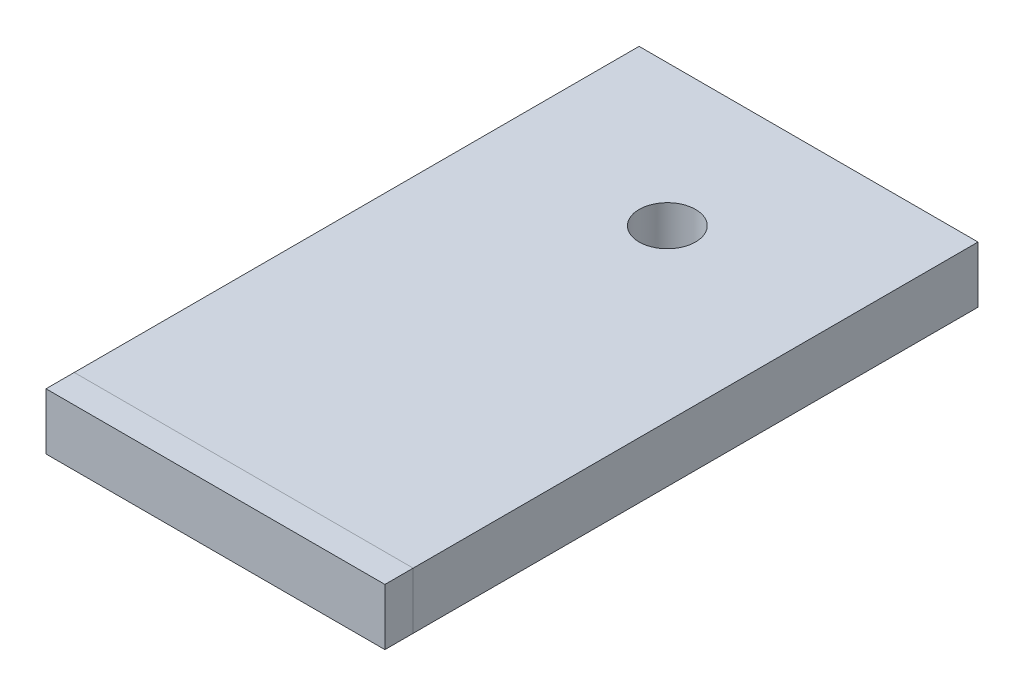
ISO-10303-21;
HEADER;
FILE_DESCRIPTION(('STEP AP214'),'2;1');
FILE_NAME('part.step','',(''),(''),'','','');
FILE_SCHEMA(('AUTOMOTIVE_DESIGN { 1 0 10303 214 1 1 1 1 }'));
ENDSEC;
DATA;
#1=APPLICATION_CONTEXT('core data for automotive mechanical design processes');
#2=APPLICATION_PROTOCOL_DEFINITION('international standard','automotive_design',2000,#1);
#3=PRODUCT_CONTEXT('',#1,'mechanical');
#4=PRODUCT('Part','Part','',(#3));
#5=PRODUCT_RELATED_PRODUCT_CATEGORY('part','',(#4));
#6=PRODUCT_DEFINITION_FORMATION('','',#4);
#7=PRODUCT_DEFINITION_CONTEXT('part definition',#1,'design');
#8=PRODUCT_DEFINITION('design','',#6,#7);
#9=PRODUCT_DEFINITION_SHAPE('','',#8);
#10=(LENGTH_UNIT() NAMED_UNIT(*) SI_UNIT(.MILLI.,.METRE.));
#11=(NAMED_UNIT(*) PLANE_ANGLE_UNIT() SI_UNIT($,.RADIAN.));
#12=(NAMED_UNIT(*) SI_UNIT($,.STERADIAN.) SOLID_ANGLE_UNIT());
#13=UNCERTAINTY_MEASURE_WITH_UNIT(LENGTH_MEASURE(1.E-05),#10,'distance_accuracy_value','');
#14=(GEOMETRIC_REPRESENTATION_CONTEXT(3) GLOBAL_UNCERTAINTY_ASSIGNED_CONTEXT((#13)) GLOBAL_UNIT_ASSIGNED_CONTEXT((#10,
#11,#12)) REPRESENTATION_CONTEXT('',''));
#15=CARTESIAN_POINT('',(0.,0.,0.));
#16=DIRECTION('',(0.,0.,1.));
#17=DIRECTION('',(1.,0.,0.));
#18=AXIS2_PLACEMENT_3D('',#15,#16,#17);
#19=CARTESIAN_POINT('',(38.1,19.05,69.85));
#20=DIRECTION('',(-1.,0.,0.));
#21=DIRECTION('',(0.,0.,1.));
#22=AXIS2_PLACEMENT_3D('',#19,#20,#21);
#23=PLANE('',#22);
#24=DIRECTION('',(0.,1.,0.));
#25=VECTOR('',#24,1.);
#26=CARTESIAN_POINT('',(38.1,19.05,69.85));
#27=LINE('',#26,#25);
#28=CARTESIAN_POINT('',(38.1,6.35,69.85));
#29=VERTEX_POINT('',#28);
#30=CARTESIAN_POINT('',(38.1,19.05,69.85));
#31=VERTEX_POINT('',#30);
#32=EDGE_CURVE('E100',#29,#31,#27,.T.);
#33=ORIENTED_EDGE('',*,*,#32,.F.);
#34=DIRECTION('',(0.,0.,-1.));
#35=VECTOR('',#34,1.);
#36=CARTESIAN_POINT('',(38.1,6.35,69.85));
#37=LINE('',#36,#35);
#38=CARTESIAN_POINT('',(38.1,6.35,63.5));
#39=VERTEX_POINT('',#38);
#40=EDGE_CURVE('E105',#29,#39,#37,.T.);
#41=ORIENTED_EDGE('',*,*,#40,.T.);
#42=DIRECTION('',(0.,1.,0.));
#43=VECTOR('',#42,1.);
#44=CARTESIAN_POINT('',(38.1,19.05,63.5));
#45=LINE('',#44,#43);
#46=CARTESIAN_POINT('',(38.1,19.05,63.5));
#47=VERTEX_POINT('',#46);
#48=EDGE_CURVE('E92',#39,#47,#45,.T.);
#49=ORIENTED_EDGE('',*,*,#48,.T.);
#50=DIRECTION('',(0.,0.,-1.));
#51=VECTOR('',#50,1.);
#52=CARTESIAN_POINT('',(38.1,19.05,69.85));
#53=LINE('',#52,#51);
#54=EDGE_CURVE('E54',#31,#47,#53,.T.);
#55=ORIENTED_EDGE('',*,*,#54,.F.);
#56=EDGE_LOOP('',(#33,#41,#49,#55));
#57=FACE_BOUND('',#56,.T.);
#58=ADVANCED_FACE('F47',(#57),#23,.F.);
#59=CARTESIAN_POINT('',(-38.1,19.05,69.85));
#60=DIRECTION('',(0.,-1.,0.));
#61=DIRECTION('',(0.,0.,-1.));
#62=AXIS2_PLACEMENT_3D('',#59,#60,#61);
#63=PLANE('',#62);
#64=DIRECTION('',(-1.,0.,0.));
#65=VECTOR('',#64,1.);
#66=CARTESIAN_POINT('',(-38.1,19.05,63.5));
#67=LINE('',#66,#65);
#68=CARTESIAN_POINT('',(-38.1,19.05,63.5));
#69=VERTEX_POINT('',#68);
#70=EDGE_CURVE('E82',#47,#69,#67,.T.);
#71=ORIENTED_EDGE('',*,*,#70,.T.);
#72=DIRECTION('',(0.,0.,-1.));
#73=VECTOR('',#72,1.);
#74=CARTESIAN_POINT('',(-38.1,19.05,69.85));
#75=LINE('',#74,#73);
#76=CARTESIAN_POINT('',(-38.1,19.05,69.85));
#77=VERTEX_POINT('',#76);
#78=EDGE_CURVE('E85',#77,#69,#75,.T.);
#79=ORIENTED_EDGE('',*,*,#78,.F.);
#80=DIRECTION('',(-1.,0.,0.));
#81=VECTOR('',#80,1.);
#82=CARTESIAN_POINT('',(-38.1,19.05,69.85));
#83=LINE('',#82,#81);
#84=EDGE_CURVE('E69',#31,#77,#83,.T.);
#85=ORIENTED_EDGE('',*,*,#84,.F.);
#86=ORIENTED_EDGE('',*,*,#54,.T.);
#87=EDGE_LOOP('',(#71,#79,#85,#86));
#88=FACE_BOUND('',#87,.T.);
#89=ADVANCED_FACE('F84',(#88),#63,.F.);
#90=CARTESIAN_POINT('',(-38.1,19.05,69.85));
#91=DIRECTION('',(1.,0.,0.));
#92=DIRECTION('',(0.,0.,-1.));
#93=AXIS2_PLACEMENT_3D('',#90,#91,#92);
#94=PLANE('',#93);
#95=DIRECTION('',(0.,-1.,0.));
#96=VECTOR('',#95,1.);
#97=CARTESIAN_POINT('',(-38.1,19.05,63.5));
#98=LINE('',#97,#96);
#99=CARTESIAN_POINT('',(-38.1,6.35,63.5));
#100=VERTEX_POINT('',#99);
#101=EDGE_CURVE('E91',#69,#100,#98,.T.);
#102=ORIENTED_EDGE('',*,*,#101,.T.);
#103=DIRECTION('',(0.,0.,-1.));
#104=VECTOR('',#103,1.);
#105=CARTESIAN_POINT('',(-38.1,6.35,69.85));
#106=LINE('',#105,#104);
#107=CARTESIAN_POINT('',(-38.1,6.35,69.85));
#108=VERTEX_POINT('',#107);
#109=EDGE_CURVE('E61',#108,#100,#106,.T.);
#110=ORIENTED_EDGE('',*,*,#109,.F.);
#111=DIRECTION('',(0.,-1.,0.));
#112=VECTOR('',#111,1.);
#113=CARTESIAN_POINT('',(-38.1,19.05,69.85));
#114=LINE('',#113,#112);
#115=EDGE_CURVE('E97',#77,#108,#114,.T.);
#116=ORIENTED_EDGE('',*,*,#115,.F.);
#117=ORIENTED_EDGE('',*,*,#78,.T.);
#118=EDGE_LOOP('',(#102,#110,#116,#117));
#119=FACE_BOUND('',#118,.T.);
#120=ADVANCED_FACE('F96',(#119),#94,.F.);
#121=CARTESIAN_POINT('',(0.,0.,69.85));
#122=DIRECTION('',(0.,0.,1.));
#123=DIRECTION('',(1.,0.,0.));
#124=AXIS2_PLACEMENT_3D('',#121,#122,#123);
#125=PLANE('',#124);
#126=ORIENTED_EDGE('',*,*,#115,.T.);
#127=DIRECTION('',(1.,0.,0.));
#128=VECTOR('',#127,1.);
#129=CARTESIAN_POINT('',(38.1,6.35,69.85));
#130=LINE('',#129,#128);
#131=EDGE_CURVE('E109',#108,#29,#130,.T.);
#132=ORIENTED_EDGE('',*,*,#131,.T.);
#133=ORIENTED_EDGE('',*,*,#32,.T.);
#134=ORIENTED_EDGE('',*,*,#84,.T.);
#135=EDGE_LOOP('',(#126,#132,#133,#134));
#136=FACE_BOUND('',#135,.T.);
#137=ADVANCED_FACE('F115',(#136),#125,.T.);
#138=CARTESIAN_POINT('',(0.,0.,63.5));
#139=DIRECTION('',(0.,0.,1.));
#140=DIRECTION('',(1.,0.,0.));
#141=AXIS2_PLACEMENT_3D('',#138,#139,#140);
#142=PLANE('',#141);
#143=ORIENTED_EDGE('',*,*,#48,.F.);
#144=DIRECTION('',(-1.,0.,0.));
#145=VECTOR('',#144,1.);
#146=CARTESIAN_POINT('',(0.,6.35,63.5));
#147=LINE('',#146,#145);
#148=EDGE_CURVE('E12',#39,#100,#147,.T.);
#149=ORIENTED_EDGE('',*,*,#148,.T.);
#150=ORIENTED_EDGE('',*,*,#101,.F.);
#151=ORIENTED_EDGE('',*,*,#70,.F.);
#152=EDGE_LOOP('',(#143,#149,#150,#151));
#153=FACE_BOUND('',#152,.T.);
#154=ADVANCED_FACE('F99',(#153),#142,.F.);
#155=CARTESIAN_POINT('',(38.1,6.35,69.85));
#156=DIRECTION('',(0.,1.,0.));
#157=DIRECTION('',(0.,0.,1.));
#158=AXIS2_PLACEMENT_3D('',#155,#156,#157);
#159=PLANE('',#158);
#160=ORIENTED_EDGE('',*,*,#40,.F.);
#161=ORIENTED_EDGE('',*,*,#131,.F.);
#162=ORIENTED_EDGE('',*,*,#109,.T.);
#163=ORIENTED_EDGE('',*,*,#148,.F.);
#164=EDGE_LOOP('',(#160,#161,#162,#163));
#165=FACE_BOUND('',#164,.T.);
#166=ADVANCED_FACE('F121',(#165),#159,.F.);
#167=CLOSED_SHELL('',(#58,#89,#120,#137,#154,#166));
#168=MANIFOLD_SOLID_BREP('B2',#167);
#169=CARTESIAN_POINT('',(0.,0.,0.));
#170=DIRECTION('',(0.,1.,0.));
#171=DIRECTION('',(0.,0.,1.));
#172=AXIS2_PLACEMENT_3D('',#169,#170,#171);
#173=PLANE('',#172);
#174=DIRECTION('',(-1.,0.,0.));
#175=VECTOR('',#174,1.);
#176=CARTESIAN_POINT('',(-38.1,0.,-63.5));
#177=LINE('',#176,#175);
#178=CARTESIAN_POINT('',(4.365625,0.,-63.5));
#179=VERTEX_POINT('',#178);
#180=CARTESIAN_POINT('',(-4.365625,0.,-63.5));
#181=VERTEX_POINT('',#180);
#182=EDGE_CURVE('E282',#179,#181,#177,.T.);
#183=ORIENTED_EDGE('',*,*,#182,.F.);
#184=DIRECTION('',(0.,0.,-1.));
#185=VECTOR('',#184,1.);
#186=CARTESIAN_POINT('',(4.365625,0.,69.85));
#187=LINE('',#186,#185);
#188=CARTESIAN_POINT('',(4.365625,0.,-36.3612707965782));
#189=VERTEX_POINT('',#188);
#190=EDGE_CURVE('E263',#189,#179,#187,.T.);
#191=ORIENTED_EDGE('',*,*,#190,.F.);
#192=CARTESIAN_POINT('',(0.,0.,-31.75));
#193=DIRECTION('',(0.,1.,0.));
#194=DIRECTION('',(0.,0.,1.));
#195=AXIS2_PLACEMENT_3D('',#192,#193,#194);
#196=CIRCLE('',#195,6.35);
#197=CARTESIAN_POINT('',(-4.365625,0.,-36.3612707965782));
#198=VERTEX_POINT('',#197);
#199=EDGE_CURVE('E288',#189,#198,#196,.T.);
#200=ORIENTED_EDGE('',*,*,#199,.T.);
#201=DIRECTION('',(0.,0.,-1.));
#202=VECTOR('',#201,1.);
#203=CARTESIAN_POINT('',(-4.365625,0.,69.85));
#204=LINE('',#203,#202);
#205=EDGE_CURVE('E286',#198,#181,#204,.T.);
#206=ORIENTED_EDGE('',*,*,#205,.T.);
#207=EDGE_LOOP('',(#183,#191,#200,#206));
#208=FACE_BOUND('',#207,.T.);
#209=ADVANCED_FACE('F176',(#208),#173,.F.);
#210=CARTESIAN_POINT('',(38.1,19.05,-63.5));
#211=DIRECTION('',(-1.,0.,0.));
#212=DIRECTION('',(0.,0.,1.));
#213=AXIS2_PLACEMENT_3D('',#210,#211,#212);
#214=PLANE('',#213);
#215=DIRECTION('',(0.,-1.,0.));
#216=VECTOR('',#215,1.);
#217=CARTESIAN_POINT('',(38.1,19.05,63.5));
#218=LINE('',#217,#216);
#219=CARTESIAN_POINT('',(38.1,19.05,63.5));
#220=VERTEX_POINT('',#219);
#221=CARTESIAN_POINT('',(38.1,6.35,63.5));
#222=VERTEX_POINT('',#221);
#223=EDGE_CURVE('E299',#220,#222,#218,.T.);
#224=ORIENTED_EDGE('',*,*,#223,.T.);
#225=DIRECTION('',(0.,0.,-1.));
#226=VECTOR('',#225,1.);
#227=CARTESIAN_POINT('',(38.1,6.35,69.85));
#228=LINE('',#227,#226);
#229=CARTESIAN_POINT('',(38.1,6.35,-63.5));
#230=VERTEX_POINT('',#229);
#231=EDGE_CURVE('E334',#222,#230,#228,.T.);
#232=ORIENTED_EDGE('',*,*,#231,.T.);
#233=DIRECTION('',(0.,-1.,0.));
#234=VECTOR('',#233,1.);
#235=CARTESIAN_POINT('',(38.1,19.05,-63.5));
#236=LINE('',#235,#234);
#237=CARTESIAN_POINT('',(38.1,19.05,-63.5));
#238=VERTEX_POINT('',#237);
#239=EDGE_CURVE('E308',#238,#230,#236,.T.);
#240=ORIENTED_EDGE('',*,*,#239,.F.);
#241=DIRECTION('',(0.,0.,-1.));
#242=VECTOR('',#241,1.);
#243=CARTESIAN_POINT('',(38.1,19.05,-63.5));
#244=LINE('',#243,#242);
#245=EDGE_CURVE('E291',#220,#238,#244,.T.);
#246=ORIENTED_EDGE('',*,*,#245,.F.);
#247=EDGE_LOOP('',(#224,#232,#240,#246));
#248=FACE_BOUND('',#247,.T.);
#249=ADVANCED_FACE('F178',(#248),#214,.F.);
#250=CARTESIAN_POINT('',(-38.1,19.05,-63.5));
#251=DIRECTION('',(0.,0.,1.));
#252=DIRECTION('',(1.,0.,0.));
#253=AXIS2_PLACEMENT_3D('',#250,#251,#252);
#254=PLANE('',#253);
#255=ORIENTED_EDGE('',*,*,#239,.T.);
#256=DIRECTION('',(1.,0.,0.));
#257=VECTOR('',#256,1.);
#258=CARTESIAN_POINT('',(38.1,6.35,-63.5));
#259=LINE('',#258,#257);
#260=CARTESIAN_POINT('',(4.365625,6.35,-63.5));
#261=VERTEX_POINT('',#260);
#262=EDGE_CURVE('E275',#261,#230,#259,.T.);
#263=ORIENTED_EDGE('',*,*,#262,.F.);
#264=DIRECTION('',(0.,1.,0.));
#265=VECTOR('',#264,1.);
#266=CARTESIAN_POINT('',(4.365625,0.,-63.5));
#267=LINE('',#266,#265);
#268=EDGE_CURVE('E266',#179,#261,#267,.T.);
#269=ORIENTED_EDGE('',*,*,#268,.F.);
#270=ORIENTED_EDGE('',*,*,#182,.T.);
#271=DIRECTION('',(0.,-1.,0.));
#272=VECTOR('',#271,1.);
#273=CARTESIAN_POINT('',(-4.365625,6.35,-63.5));
#274=LINE('',#273,#272);
#275=CARTESIAN_POINT('',(-4.365625,6.35,-63.5));
#276=VERTEX_POINT('',#275);
#277=EDGE_CURVE('E341',#276,#181,#274,.T.);
#278=ORIENTED_EDGE('',*,*,#277,.F.);
#279=DIRECTION('',(1.,0.,0.));
#280=VECTOR('',#279,1.);
#281=CARTESIAN_POINT('',(-4.365625,6.35,-63.5));
#282=LINE('',#281,#280);
#283=CARTESIAN_POINT('',(-38.1,6.35,-63.5));
#284=VERTEX_POINT('',#283);
#285=EDGE_CURVE('E343',#284,#276,#282,.T.);
#286=ORIENTED_EDGE('',*,*,#285,.F.);
#287=DIRECTION('',(0.,-1.,0.));
#288=VECTOR('',#287,1.);
#289=CARTESIAN_POINT('',(-38.1,19.05,-63.5));
#290=LINE('',#289,#288);
#291=CARTESIAN_POINT('',(-38.1,19.05,-63.5));
#292=VERTEX_POINT('',#291);
#293=EDGE_CURVE('E305',#292,#284,#290,.T.);
#294=ORIENTED_EDGE('',*,*,#293,.F.);
#295=DIRECTION('',(-1.,0.,0.));
#296=VECTOR('',#295,1.);
#297=CARTESIAN_POINT('',(-38.1,19.05,-63.5));
#298=LINE('',#297,#296);
#299=EDGE_CURVE('E363',#238,#292,#298,.T.);
#300=ORIENTED_EDGE('',*,*,#299,.F.);
#301=EDGE_LOOP('',(#255,#263,#269,#270,#278,#286,#294,#300));
#302=FACE_BOUND('',#301,.T.);
#303=ADVANCED_FACE('F280',(#302),#254,.F.);
#304=CARTESIAN_POINT('',(-38.1,19.05,-63.5));
#305=DIRECTION('',(1.,0.,0.));
#306=DIRECTION('',(0.,0.,-1.));
#307=AXIS2_PLACEMENT_3D('',#304,#305,#306);
#308=PLANE('',#307);
#309=ORIENTED_EDGE('',*,*,#293,.T.);
#310=DIRECTION('',(0.,0.,-1.));
#311=VECTOR('',#310,1.);
#312=CARTESIAN_POINT('',(-38.1,6.35,69.85));
#313=LINE('',#312,#311);
#314=CARTESIAN_POINT('',(-38.1,6.35,63.5));
#315=VERTEX_POINT('',#314);
#316=EDGE_CURVE('E346',#315,#284,#313,.T.);
#317=ORIENTED_EDGE('',*,*,#316,.F.);
#318=DIRECTION('',(0.,-1.,0.));
#319=VECTOR('',#318,1.);
#320=CARTESIAN_POINT('',(-38.1,19.05,63.5));
#321=LINE('',#320,#319);
#322=CARTESIAN_POINT('',(-38.1,19.05,63.5));
#323=VERTEX_POINT('',#322);
#324=EDGE_CURVE('E302',#323,#315,#321,.T.);
#325=ORIENTED_EDGE('',*,*,#324,.F.);
#326=DIRECTION('',(0.,0.,1.));
#327=VECTOR('',#326,1.);
#328=CARTESIAN_POINT('',(-38.1,19.05,-63.5));
#329=LINE('',#328,#327);
#330=EDGE_CURVE('E364',#292,#323,#329,.T.);
#331=ORIENTED_EDGE('',*,*,#330,.F.);
#332=EDGE_LOOP('',(#309,#317,#325,#331));
#333=FACE_BOUND('',#332,.T.);
#334=ADVANCED_FACE('F380',(#333),#308,.F.);
#335=CARTESIAN_POINT('',(-38.1,19.05,63.5));
#336=DIRECTION('',(0.,0.,-1.));
#337=DIRECTION('',(-1.,0.,0.));
#338=AXIS2_PLACEMENT_3D('',#335,#336,#337);
#339=PLANE('',#338);
#340=DIRECTION('',(0.,1.,0.));
#341=VECTOR('',#340,1.);
#342=CARTESIAN_POINT('',(4.365625,19.05,63.5));
#343=LINE('',#342,#341);
#344=CARTESIAN_POINT('',(4.365625,0.,63.5));
#345=VERTEX_POINT('',#344);
#346=CARTESIAN_POINT('',(4.365625,6.35,63.5));
#347=VERTEX_POINT('',#346);
#348=EDGE_CURVE('E355',#345,#347,#343,.T.);
#349=ORIENTED_EDGE('',*,*,#348,.T.);
#350=DIRECTION('',(1.,0.,0.));
#351=VECTOR('',#350,1.);
#352=CARTESIAN_POINT('',(-38.1,6.35,63.5));
#353=LINE('',#352,#351);
#354=EDGE_CURVE('E331',#347,#222,#353,.T.);
#355=ORIENTED_EDGE('',*,*,#354,.T.);
#356=ORIENTED_EDGE('',*,*,#223,.F.);
#357=DIRECTION('',(1.,0.,0.));
#358=VECTOR('',#357,1.);
#359=CARTESIAN_POINT('',(-38.1,19.05,63.5));
#360=LINE('',#359,#358);
#361=EDGE_CURVE('E296',#323,#220,#360,.T.);
#362=ORIENTED_EDGE('',*,*,#361,.F.);
#363=ORIENTED_EDGE('',*,*,#324,.T.);
#364=DIRECTION('',(1.,0.,0.));
#365=VECTOR('',#364,1.);
#366=CARTESIAN_POINT('',(-38.1,6.35,63.5));
#367=LINE('',#366,#365);
#368=CARTESIAN_POINT('',(-4.365625,6.35,63.5));
#369=VERTEX_POINT('',#368);
#370=EDGE_CURVE('E337',#315,#369,#367,.T.);
#371=ORIENTED_EDGE('',*,*,#370,.T.);
#372=DIRECTION('',(0.,-1.,0.));
#373=VECTOR('',#372,1.);
#374=CARTESIAN_POINT('',(-4.365625,19.05,63.5));
#375=LINE('',#374,#373);
#376=CARTESIAN_POINT('',(-4.365625,0.,63.5));
#377=VERTEX_POINT('',#376);
#378=EDGE_CURVE('E352',#369,#377,#375,.T.);
#379=ORIENTED_EDGE('',*,*,#378,.T.);
#380=DIRECTION('',(1.,0.,0.));
#381=VECTOR('',#380,1.);
#382=CARTESIAN_POINT('',(-38.1,0.,63.5));
#383=LINE('',#382,#381);
#384=EDGE_CURVE('E287',#377,#345,#383,.T.);
#385=ORIENTED_EDGE('',*,*,#384,.T.);
#386=EDGE_LOOP('',(#349,#355,#356,#362,#363,#371,#379,#385));
#387=FACE_BOUND('',#386,.T.);
#388=ADVANCED_FACE('F374',(#387),#339,.F.);
#389=CARTESIAN_POINT('',(0.,19.05,0.));
#390=DIRECTION('',(0.,1.,0.));
#391=DIRECTION('',(0.,0.,1.));
#392=AXIS2_PLACEMENT_3D('',#389,#390,#391);
#393=PLANE('',#392);
#394=CARTESIAN_POINT('',(0.,19.05,-31.75));
#395=DIRECTION('',(0.,1.,0.));
#396=DIRECTION('',(0.,0.,1.));
#397=AXIS2_PLACEMENT_3D('',#394,#395,#396);
#398=CIRCLE('',#397,6.35);
#399=CARTESIAN_POINT('',(0.,19.05,-25.4));
#400=VERTEX_POINT('',#399);
#401=EDGE_CURVE('E357',#400,#400,#398,.T.);
#402=ORIENTED_EDGE('',*,*,#401,.F.);
#403=EDGE_LOOP('',(#402));
#404=FACE_BOUND('',#403,.T.);
#405=ORIENTED_EDGE('',*,*,#245,.T.);
#406=ORIENTED_EDGE('',*,*,#299,.T.);
#407=ORIENTED_EDGE('',*,*,#330,.T.);
#408=ORIENTED_EDGE('',*,*,#361,.T.);
#409=EDGE_LOOP('',(#405,#406,#407,#408));
#410=FACE_BOUND('',#409,.T.);
#411=ADVANCED_FACE('F370',(#404,#410),#393,.T.);
#412=CARTESIAN_POINT('',(-4.365625,0.,-27.1387292034218));
#413=VERTEX_POINT('',#412);
#414=CARTESIAN_POINT('',(4.365625,0.,-27.1387292034218));
#415=VERTEX_POINT('',#414);
#416=EDGE_CURVE('E293',#413,#415,#196,.T.);
#417=ORIENTED_EDGE('',*,*,#416,.T.);
#418=EDGE_CURVE('E274',#345,#415,#187,.T.);
#419=ORIENTED_EDGE('',*,*,#418,.F.);
#420=ORIENTED_EDGE('',*,*,#384,.F.);
#421=EDGE_CURVE('E348',#377,#413,#204,.T.);
#422=ORIENTED_EDGE('',*,*,#421,.T.);
#423=EDGE_LOOP('',(#417,#419,#420,#422));
#424=FACE_BOUND('',#423,.T.);
#425=ADVANCED_FACE('F390',(#424),#173,.F.);
#426=CARTESIAN_POINT('',(0.,0.,-31.75));
#427=DIRECTION('',(0.,1.,0.));
#428=DIRECTION('',(0.,0.,1.));
#429=AXIS2_PLACEMENT_3D('',#426,#427,#428);
#430=CYLINDRICAL_SURFACE('',#429,6.35);
#431=CARTESIAN_POINT('',(0.,6.35,-31.75));
#432=DIRECTION('',(0.,1.,0.));
#433=DIRECTION('',(0.,0.,1.));
#434=AXIS2_PLACEMENT_3D('',#431,#432,#433);
#435=CIRCLE('',#434,6.35);
#436=CARTESIAN_POINT('',(4.365625,6.35,-36.3612707965782));
#437=VERTEX_POINT('',#436);
#438=CARTESIAN_POINT('',(4.365625,6.35,-27.1387292034218));
#439=VERTEX_POINT('',#438);
#440=EDGE_CURVE('E184',#437,#439,#435,.F.);
#441=ORIENTED_EDGE('',*,*,#440,.T.);
#442=DIRECTION('',(0.,1.,0.));
#443=VECTOR('',#442,1.);
#444=CARTESIAN_POINT('',(4.365625,0.,-27.1387292034218));
#445=LINE('',#444,#443);
#446=EDGE_CURVE('E45',#439,#415,#445,.F.);
#447=ORIENTED_EDGE('',*,*,#446,.T.);
#448=ORIENTED_EDGE('',*,*,#416,.F.);
#449=DIRECTION('',(0.,1.,0.));
#450=VECTOR('',#449,1.);
#451=CARTESIAN_POINT('',(-4.365625,0.,-27.1387292034218));
#452=LINE('',#451,#450);
#453=CARTESIAN_POINT('',(-4.365625,6.35,-27.1387292034218));
#454=VERTEX_POINT('',#453);
#455=EDGE_CURVE('E313',#413,#454,#452,.T.);
#456=ORIENTED_EDGE('',*,*,#455,.T.);
#457=CARTESIAN_POINT('',(0.,6.35,-31.75));
#458=DIRECTION('',(0.,1.,0.));
#459=DIRECTION('',(0.,0.,1.));
#460=AXIS2_PLACEMENT_3D('',#457,#458,#459);
#461=CIRCLE('',#460,6.35);
#462=CARTESIAN_POINT('',(-4.365625,6.35,-36.3612707965782));
#463=VERTEX_POINT('',#462);
#464=EDGE_CURVE('E310',#454,#463,#461,.F.);
#465=ORIENTED_EDGE('',*,*,#464,.T.);
#466=DIRECTION('',(0.,1.,0.));
#467=VECTOR('',#466,1.);
#468=CARTESIAN_POINT('',(-4.365625,0.,-36.3612707965782));
#469=LINE('',#468,#467);
#470=EDGE_CURVE('E316',#463,#198,#469,.F.);
#471=ORIENTED_EDGE('',*,*,#470,.T.);
#472=ORIENTED_EDGE('',*,*,#199,.F.);
#473=DIRECTION('',(0.,1.,0.));
#474=VECTOR('',#473,1.);
#475=CARTESIAN_POINT('',(4.365625,0.,-36.3612707965782));
#476=LINE('',#475,#474);
#477=EDGE_CURVE('E269',#189,#437,#476,.T.);
#478=ORIENTED_EDGE('',*,*,#477,.T.);
#479=EDGE_LOOP('',(#441,#447,#448,#456,#465,#471,#472,#478));
#480=FACE_BOUND('',#479,.T.);
#481=ORIENTED_EDGE('',*,*,#401,.T.);
#482=EDGE_LOOP('',(#481));
#483=FACE_BOUND('',#482,.T.);
#484=ADVANCED_FACE('F321',(#480,#483),#430,.F.);
#485=CARTESIAN_POINT('',(-4.365625,6.35,69.85));
#486=DIRECTION('',(1.,0.,0.));
#487=DIRECTION('',(0.,0.,-1.));
#488=AXIS2_PLACEMENT_3D('',#485,#486,#487);
#489=PLANE('',#488);
#490=DIRECTION('',(0.,0.,-1.));
#491=VECTOR('',#490,1.);
#492=CARTESIAN_POINT('',(-4.365625,6.35,69.85));
#493=LINE('',#492,#491);
#494=EDGE_CURVE('E283',#369,#454,#493,.T.);
#495=ORIENTED_EDGE('',*,*,#494,.T.);
#496=ORIENTED_EDGE('',*,*,#455,.F.);
#497=ORIENTED_EDGE('',*,*,#421,.F.);
#498=ORIENTED_EDGE('',*,*,#378,.F.);
#499=EDGE_LOOP('',(#495,#496,#497,#498));
#500=FACE_BOUND('',#499,.T.);
#501=ADVANCED_FACE('F386',(#500),#489,.F.);
#502=EDGE_CURVE('E199',#463,#276,#493,.T.);
#503=ORIENTED_EDGE('',*,*,#502,.T.);
#504=ORIENTED_EDGE('',*,*,#277,.T.);
#505=ORIENTED_EDGE('',*,*,#205,.F.);
#506=ORIENTED_EDGE('',*,*,#470,.F.);
#507=EDGE_LOOP('',(#503,#504,#505,#506));
#508=FACE_BOUND('',#507,.T.);
#509=ADVANCED_FACE('F420',(#508),#489,.F.);
#510=CARTESIAN_POINT('',(-4.365625,6.35,69.85));
#511=DIRECTION('',(0.,1.,0.));
#512=DIRECTION('',(0.,0.,1.));
#513=AXIS2_PLACEMENT_3D('',#510,#511,#512);
#514=PLANE('',#513);
#515=ORIENTED_EDGE('',*,*,#316,.T.);
#516=ORIENTED_EDGE('',*,*,#285,.T.);
#517=ORIENTED_EDGE('',*,*,#502,.F.);
#518=ORIENTED_EDGE('',*,*,#464,.F.);
#519=ORIENTED_EDGE('',*,*,#494,.F.);
#520=ORIENTED_EDGE('',*,*,#370,.F.);
#521=EDGE_LOOP('',(#515,#516,#517,#518,#519,#520));
#522=FACE_BOUND('',#521,.T.);
#523=ADVANCED_FACE('F383',(#522),#514,.F.);
#524=CARTESIAN_POINT('',(38.1,6.35,69.85));
#525=DIRECTION('',(0.,1.,0.));
#526=DIRECTION('',(0.,0.,1.));
#527=AXIS2_PLACEMENT_3D('',#524,#525,#526);
#528=PLANE('',#527);
#529=DIRECTION('',(0.,0.,-1.));
#530=VECTOR('',#529,1.);
#531=CARTESIAN_POINT('',(4.365625,6.35,69.85));
#532=LINE('',#531,#530);
#533=EDGE_CURVE('E329',#347,#439,#532,.T.);
#534=ORIENTED_EDGE('',*,*,#533,.T.);
#535=ORIENTED_EDGE('',*,*,#440,.F.);
#536=EDGE_CURVE('E191',#437,#261,#532,.T.);
#537=ORIENTED_EDGE('',*,*,#536,.T.);
#538=ORIENTED_EDGE('',*,*,#262,.T.);
#539=ORIENTED_EDGE('',*,*,#231,.F.);
#540=ORIENTED_EDGE('',*,*,#354,.F.);
#541=EDGE_LOOP('',(#534,#535,#537,#538,#539,#540));
#542=FACE_BOUND('',#541,.T.);
#543=ADVANCED_FACE('F327',(#542),#528,.F.);
#544=CARTESIAN_POINT('',(4.365625,0.,69.85));
#545=DIRECTION('',(-1.,0.,0.));
#546=DIRECTION('',(0.,0.,1.));
#547=AXIS2_PLACEMENT_3D('',#544,#545,#546);
#548=PLANE('',#547);
#549=ORIENTED_EDGE('',*,*,#418,.T.);
#550=ORIENTED_EDGE('',*,*,#446,.F.);
#551=ORIENTED_EDGE('',*,*,#533,.F.);
#552=ORIENTED_EDGE('',*,*,#348,.F.);
#553=EDGE_LOOP('',(#549,#550,#551,#552));
#554=FACE_BOUND('',#553,.T.);
#555=ADVANCED_FACE('F391',(#554),#548,.F.);
#556=ORIENTED_EDGE('',*,*,#190,.T.);
#557=ORIENTED_EDGE('',*,*,#268,.T.);
#558=ORIENTED_EDGE('',*,*,#536,.F.);
#559=ORIENTED_EDGE('',*,*,#477,.F.);
#560=EDGE_LOOP('',(#556,#557,#558,#559));
#561=FACE_BOUND('',#560,.T.);
#562=ADVANCED_FACE('F265',(#561),#548,.F.);
#563=CLOSED_SHELL('',(#209,#249,#303,#334,#388,#411,#425,#484,#501,#509,#523,#543,#555,#562));
#564=MANIFOLD_SOLID_BREP('B6',#563);
#565=ADVANCED_BREP_SHAPE_REPRESENTATION('',(#18,#168,#564),#14);
#566=SHAPE_DEFINITION_REPRESENTATION(#9,#565);
ENDSEC;
END-ISO-10303-21;
